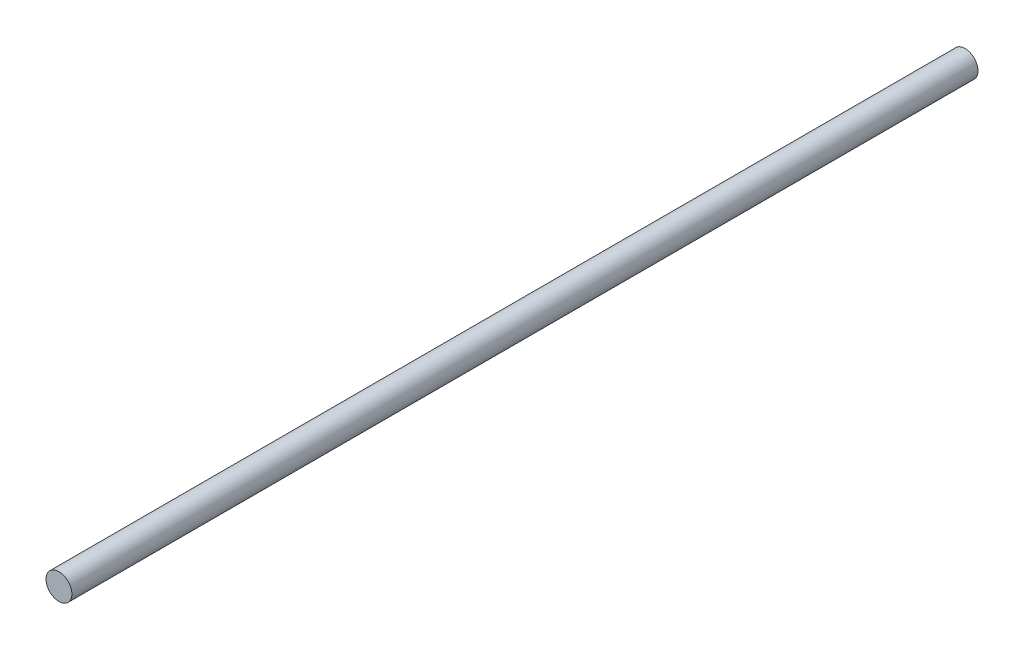
ISO-10303-21;
HEADER;
FILE_DESCRIPTION(('STEP AP214'),'2;1');
FILE_NAME('part.step','',(''),(''),'','','');
FILE_SCHEMA(('AUTOMOTIVE_DESIGN { 1 0 10303 214 1 1 1 1 }'));
ENDSEC;
DATA;
#1=APPLICATION_CONTEXT('core data for automotive mechanical design processes');
#2=APPLICATION_PROTOCOL_DEFINITION('international standard','automotive_design',2000,#1);
#3=PRODUCT_CONTEXT('',#1,'mechanical');
#4=PRODUCT('Part','Part','',(#3));
#5=PRODUCT_RELATED_PRODUCT_CATEGORY('part','',(#4));
#6=PRODUCT_DEFINITION_FORMATION('','',#4);
#7=PRODUCT_DEFINITION_CONTEXT('part definition',#1,'design');
#8=PRODUCT_DEFINITION('design','',#6,#7);
#9=PRODUCT_DEFINITION_SHAPE('','',#8);
#10=(LENGTH_UNIT() NAMED_UNIT(*) SI_UNIT(.MILLI.,.METRE.));
#11=(NAMED_UNIT(*) PLANE_ANGLE_UNIT() SI_UNIT($,.RADIAN.));
#12=(NAMED_UNIT(*) SI_UNIT($,.STERADIAN.) SOLID_ANGLE_UNIT());
#13=UNCERTAINTY_MEASURE_WITH_UNIT(LENGTH_MEASURE(1.E-05),#10,'distance_accuracy_value','');
#14=(GEOMETRIC_REPRESENTATION_CONTEXT(3) GLOBAL_UNCERTAINTY_ASSIGNED_CONTEXT((#13)) GLOBAL_UNIT_ASSIGNED_CONTEXT((#10,
#11,#12)) REPRESENTATION_CONTEXT('',''));
#15=CARTESIAN_POINT('',(0.,0.,0.));
#16=DIRECTION('',(0.,0.,1.));
#17=DIRECTION('',(1.,0.,0.));
#18=AXIS2_PLACEMENT_3D('',#15,#16,#17);
#19=CARTESIAN_POINT('',(0.,0.,700.));
#20=DIRECTION('',(0.,0.,-1.));
#21=DIRECTION('',(-1.,0.,0.));
#22=AXIS2_PLACEMENT_3D('',#19,#20,#21);
#23=CYLINDRICAL_SURFACE('',#22,10.);
#24=CARTESIAN_POINT('',(0.,0.,700.));
#25=DIRECTION('',(0.,0.,1.));
#26=DIRECTION('',(1.,0.,0.));
#27=AXIS2_PLACEMENT_3D('',#24,#25,#26);
#28=CIRCLE('',#27,10.);
#29=CARTESIAN_POINT('',(10.,0.,700.));
#30=VERTEX_POINT('',#29);
#31=EDGE_CURVE('E10',#30,#30,#28,.T.);
#32=ORIENTED_EDGE('',*,*,#31,.F.);
#33=EDGE_LOOP('',(#32));
#34=FACE_BOUND('',#33,.T.);
#35=CARTESIAN_POINT('',(0.,0.,0.));
#36=DIRECTION('',(0.,0.,1.));
#37=DIRECTION('',(1.,0.,0.));
#38=AXIS2_PLACEMENT_3D('',#35,#36,#37);
#39=CIRCLE('',#38,10.);
#40=CARTESIAN_POINT('',(10.,0.,0.));
#41=VERTEX_POINT('',#40);
#42=EDGE_CURVE('E40',#41,#41,#39,.T.);
#43=ORIENTED_EDGE('',*,*,#42,.T.);
#44=EDGE_LOOP('',(#43));
#45=FACE_BOUND('',#44,.T.);
#46=ADVANCED_FACE('F37',(#34,#45),#23,.T.);
#47=CARTESIAN_POINT('',(0.,0.,700.));
#48=DIRECTION('',(0.,0.,1.));
#49=DIRECTION('',(1.,0.,0.));
#50=AXIS2_PLACEMENT_3D('',#47,#48,#49);
#51=PLANE('',#50);
#52=ORIENTED_EDGE('',*,*,#31,.T.);
#53=EDGE_LOOP('',(#52));
#54=FACE_BOUND('',#53,.T.);
#55=ADVANCED_FACE('F54',(#54),#51,.T.);
#56=CARTESIAN_POINT('',(0.,0.,0.));
#57=DIRECTION('',(0.,0.,1.));
#58=DIRECTION('',(1.,0.,0.));
#59=AXIS2_PLACEMENT_3D('',#56,#57,#58);
#60=PLANE('',#59);
#61=ORIENTED_EDGE('',*,*,#42,.F.);
#62=EDGE_LOOP('',(#61));
#63=FACE_BOUND('',#62,.T.);
#64=ADVANCED_FACE('F52',(#63),#60,.F.);
#65=CLOSED_SHELL('',(#46,#55,#64));
#66=MANIFOLD_SOLID_BREP('B2',#65);
#67=ADVANCED_BREP_SHAPE_REPRESENTATION('',(#18,#66),#14);
#68=SHAPE_DEFINITION_REPRESENTATION(#9,#67);
ENDSEC;
END-ISO-10303-21;
